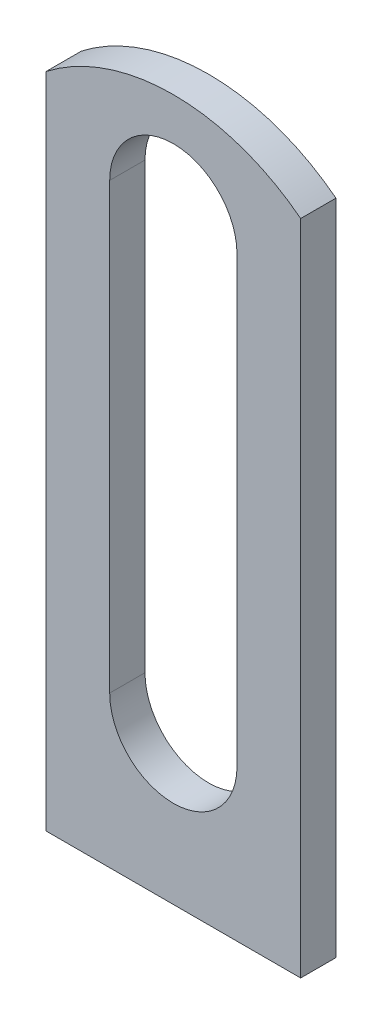
ISO-10303-21;
HEADER;
FILE_DESCRIPTION(('STEP AP214'),'2;1');
FILE_NAME('part.step','',(''),(''),'','','');
FILE_SCHEMA(('AUTOMOTIVE_DESIGN { 1 0 10303 214 1 1 1 1 }'));
ENDSEC;
DATA;
#1=APPLICATION_CONTEXT('core data for automotive mechanical design processes');
#2=APPLICATION_PROTOCOL_DEFINITION('international standard','automotive_design',2000,#1);
#3=PRODUCT_CONTEXT('',#1,'mechanical');
#4=PRODUCT('Part','Part','',(#3));
#5=PRODUCT_RELATED_PRODUCT_CATEGORY('part','',(#4));
#6=PRODUCT_DEFINITION_FORMATION('','',#4);
#7=PRODUCT_DEFINITION_CONTEXT('part definition',#1,'design');
#8=PRODUCT_DEFINITION('design','',#6,#7);
#9=PRODUCT_DEFINITION_SHAPE('','',#8);
#10=(LENGTH_UNIT() NAMED_UNIT(*) SI_UNIT(.MILLI.,.METRE.));
#11=(NAMED_UNIT(*) PLANE_ANGLE_UNIT() SI_UNIT($,.RADIAN.));
#12=(NAMED_UNIT(*) SI_UNIT($,.STERADIAN.) SOLID_ANGLE_UNIT());
#13=UNCERTAINTY_MEASURE_WITH_UNIT(LENGTH_MEASURE(1.E-05),#10,'distance_accuracy_value','');
#14=(GEOMETRIC_REPRESENTATION_CONTEXT(3) GLOBAL_UNCERTAINTY_ASSIGNED_CONTEXT((#13)) GLOBAL_UNIT_ASSIGNED_CONTEXT((#10,
#11,#12)) REPRESENTATION_CONTEXT('',''));
#15=CARTESIAN_POINT('',(0.,0.,0.));
#16=DIRECTION('',(0.,0.,1.));
#17=DIRECTION('',(1.,0.,0.));
#18=AXIS2_PLACEMENT_3D('',#15,#16,#17);
#19=CARTESIAN_POINT('',(0.,0.,0.));
#20=DIRECTION('',(0.,-1.,0.));
#21=DIRECTION('',(1.,0.,0.));
#22=AXIS2_PLACEMENT_3D('',#19,#20,#21);
#23=PLANE('',#22);
#24=DIRECTION('',(1.,0.,0.));
#25=VECTOR('',#24,1.);
#26=CARTESIAN_POINT('',(0.,0.,2.8));
#27=LINE('',#26,#25);
#28=CARTESIAN_POINT('',(0.,0.,2.8));
#29=VERTEX_POINT('',#28);
#30=CARTESIAN_POINT('',(20.2,0.,2.8));
#31=VERTEX_POINT('',#30);
#32=EDGE_CURVE('E131',#29,#31,#27,.T.);
#33=ORIENTED_EDGE('',*,*,#32,.F.);
#34=DIRECTION('',(0.,0.,1.));
#35=VECTOR('',#34,1.);
#36=CARTESIAN_POINT('',(0.,0.,0.));
#37=LINE('',#36,#35);
#38=CARTESIAN_POINT('',(0.,0.,0.));
#39=VERTEX_POINT('',#38);
#40=EDGE_CURVE('E11',#39,#29,#37,.T.);
#41=ORIENTED_EDGE('',*,*,#40,.F.);
#42=DIRECTION('',(1.,0.,0.));
#43=VECTOR('',#42,1.);
#44=CARTESIAN_POINT('',(0.,0.,0.));
#45=LINE('',#44,#43);
#46=CARTESIAN_POINT('',(20.2,0.,0.));
#47=VERTEX_POINT('',#46);
#48=EDGE_CURVE('E135',#39,#47,#45,.T.);
#49=ORIENTED_EDGE('',*,*,#48,.T.);
#50=DIRECTION('',(0.,0.,1.));
#51=VECTOR('',#50,1.);
#52=CARTESIAN_POINT('',(20.2,0.,0.));
#53=LINE('',#52,#51);
#54=EDGE_CURVE('E36',#47,#31,#53,.T.);
#55=ORIENTED_EDGE('',*,*,#54,.T.);
#56=EDGE_LOOP('',(#33,#41,#49,#55));
#57=FACE_BOUND('',#56,.T.);
#58=ADVANCED_FACE('F33',(#57),#23,.T.);
#59=CARTESIAN_POINT('',(0.,52.1796300253284,0.));
#60=DIRECTION('',(-1.,0.,0.));
#61=DIRECTION('',(0.,0.,1.));
#62=AXIS2_PLACEMENT_3D('',#59,#60,#61);
#63=PLANE('',#62);
#64=DIRECTION('',(0.,-1.,0.));
#65=VECTOR('',#64,1.);
#66=CARTESIAN_POINT('',(0.,52.1796300253284,2.8));
#67=LINE('',#66,#65);
#68=CARTESIAN_POINT('',(0.,52.1796300253284,2.8));
#69=VERTEX_POINT('',#68);
#70=EDGE_CURVE('E139',#69,#29,#67,.T.);
#71=ORIENTED_EDGE('',*,*,#70,.F.);
#72=DIRECTION('',(0.,0.,1.));
#73=VECTOR('',#72,1.);
#74=CARTESIAN_POINT('',(0.,52.1796300253284,0.));
#75=LINE('',#74,#73);
#76=CARTESIAN_POINT('',(0.,52.1796300253284,0.));
#77=VERTEX_POINT('',#76);
#78=EDGE_CURVE('E41',#77,#69,#75,.T.);
#79=ORIENTED_EDGE('',*,*,#78,.F.);
#80=DIRECTION('',(0.,-1.,0.));
#81=VECTOR('',#80,1.);
#82=CARTESIAN_POINT('',(0.,52.1796300253284,0.));
#83=LINE('',#82,#81);
#84=EDGE_CURVE('E145',#77,#39,#83,.T.);
#85=ORIENTED_EDGE('',*,*,#84,.T.);
#86=ORIENTED_EDGE('',*,*,#40,.T.);
#87=EDGE_LOOP('',(#71,#79,#85,#86));
#88=FACE_BOUND('',#87,.T.);
#89=ADVANCED_FACE('F171',(#88),#63,.T.);
#90=CARTESIAN_POINT('',(10.1,39.1850926484793,0.));
#91=DIRECTION('',(0.,0.,1.));
#92=DIRECTION('',(1.,0.,0.));
#93=AXIS2_PLACEMENT_3D('',#90,#91,#92);
#94=CYLINDRICAL_SURFACE('',#93,16.4580679801224);
#95=CARTESIAN_POINT('',(10.1,39.1850926484793,2.8));
#96=DIRECTION('',(0.,0.,1.));
#97=DIRECTION('',(-1.,0.,0.));
#98=AXIS2_PLACEMENT_3D('',#95,#96,#97);
#99=CIRCLE('',#98,16.4580679801224);
#100=CARTESIAN_POINT('',(20.2,52.1796300253284,2.8));
#101=VERTEX_POINT('',#100);
#102=EDGE_CURVE('E153',#101,#69,#99,.T.);
#103=ORIENTED_EDGE('',*,*,#102,.F.);
#104=DIRECTION('',(0.,0.,1.));
#105=VECTOR('',#104,1.);
#106=CARTESIAN_POINT('',(20.2,52.1796300253284,0.));
#107=LINE('',#106,#105);
#108=CARTESIAN_POINT('',(20.2,52.1796300253284,0.));
#109=VERTEX_POINT('',#108);
#110=EDGE_CURVE('E158',#109,#101,#107,.T.);
#111=ORIENTED_EDGE('',*,*,#110,.F.);
#112=CARTESIAN_POINT('',(10.1,39.1850926484793,0.));
#113=DIRECTION('',(0.,0.,1.));
#114=DIRECTION('',(-1.,0.,0.));
#115=AXIS2_PLACEMENT_3D('',#112,#113,#114);
#116=CIRCLE('',#115,16.4580679801224);
#117=EDGE_CURVE('E142',#109,#77,#116,.T.);
#118=ORIENTED_EDGE('',*,*,#117,.T.);
#119=ORIENTED_EDGE('',*,*,#78,.T.);
#120=EDGE_LOOP('',(#103,#111,#118,#119));
#121=FACE_BOUND('',#120,.T.);
#122=ADVANCED_FACE('F175',(#121),#94,.T.);
#123=CARTESIAN_POINT('',(20.2,0.,0.));
#124=DIRECTION('',(1.,0.,0.));
#125=DIRECTION('',(0.,0.,-1.));
#126=AXIS2_PLACEMENT_3D('',#123,#124,#125);
#127=PLANE('',#126);
#128=DIRECTION('',(0.,1.,0.));
#129=VECTOR('',#128,1.);
#130=CARTESIAN_POINT('',(20.2,0.,2.8));
#131=LINE('',#130,#129);
#132=EDGE_CURVE('E150',#31,#101,#131,.T.);
#133=ORIENTED_EDGE('',*,*,#132,.F.);
#134=ORIENTED_EDGE('',*,*,#54,.F.);
#135=DIRECTION('',(0.,1.,0.));
#136=VECTOR('',#135,1.);
#137=CARTESIAN_POINT('',(20.2,0.,0.));
#138=LINE('',#137,#136);
#139=EDGE_CURVE('E138',#47,#109,#138,.T.);
#140=ORIENTED_EDGE('',*,*,#139,.T.);
#141=ORIENTED_EDGE('',*,*,#110,.T.);
#142=EDGE_LOOP('',(#133,#134,#140,#141));
#143=FACE_BOUND('',#142,.T.);
#144=ADVANCED_FACE('F166',(#143),#127,.T.);
#145=CARTESIAN_POINT('',(10.1,39.1850926484793,0.));
#146=DIRECTION('',(0.,0.,-1.));
#147=DIRECTION('',(-1.,0.,0.));
#148=AXIS2_PLACEMENT_3D('',#145,#146,#147);
#149=PLANE('',#148);
#150=CARTESIAN_POINT('',(10.1,47.2223420938085,0.));
#151=DIRECTION('',(0.,0.,1.));
#152=DIRECTION('',(-1.,0.,0.));
#153=AXIS2_PLACEMENT_3D('',#150,#151,#152);
#154=CIRCLE('',#153,5.04999999999999);
#155=CARTESIAN_POINT('',(15.15,47.2223420938085,0.));
#156=VERTEX_POINT('',#155);
#157=CARTESIAN_POINT('',(5.05000000000003,47.2223420938085,0.));
#158=VERTEX_POINT('',#157);
#159=EDGE_CURVE('E100',#156,#158,#154,.T.);
#160=ORIENTED_EDGE('',*,*,#159,.T.);
#161=DIRECTION('',(0.,-1.,0.));
#162=VECTOR('',#161,1.);
#163=CARTESIAN_POINT('',(5.05,12.,0.));
#164=LINE('',#163,#162);
#165=CARTESIAN_POINT('',(5.05,12.,0.));
#166=VERTEX_POINT('',#165);
#167=EDGE_CURVE('E109',#158,#166,#164,.T.);
#168=ORIENTED_EDGE('',*,*,#167,.T.);
#169=CARTESIAN_POINT('',(10.1,12.,0.));
#170=DIRECTION('',(0.,0.,1.));
#171=DIRECTION('',(-1.,0.,0.));
#172=AXIS2_PLACEMENT_3D('',#169,#170,#171);
#173=CIRCLE('',#172,5.05);
#174=CARTESIAN_POINT('',(15.15,12.,0.));
#175=VERTEX_POINT('',#174);
#176=EDGE_CURVE('E49',#166,#175,#173,.T.);
#177=ORIENTED_EDGE('',*,*,#176,.T.);
#178=DIRECTION('',(0.,1.,0.));
#179=VECTOR('',#178,1.);
#180=CARTESIAN_POINT('',(15.15,47.2223420938085,0.));
#181=LINE('',#180,#179);
#182=EDGE_CURVE('E106',#175,#156,#181,.T.);
#183=ORIENTED_EDGE('',*,*,#182,.T.);
#184=EDGE_LOOP('',(#160,#168,#177,#183));
#185=FACE_BOUND('',#184,.T.);
#186=ORIENTED_EDGE('',*,*,#48,.F.);
#187=ORIENTED_EDGE('',*,*,#84,.F.);
#188=ORIENTED_EDGE('',*,*,#117,.F.);
#189=ORIENTED_EDGE('',*,*,#139,.F.);
#190=EDGE_LOOP('',(#186,#187,#188,#189));
#191=FACE_BOUND('',#190,.T.);
#192=ADVANCED_FACE('F113',(#185,#191),#149,.T.);
#193=CARTESIAN_POINT('',(10.1,39.1850926484793,2.8));
#194=DIRECTION('',(0.,0.,-1.));
#195=DIRECTION('',(-1.,0.,0.));
#196=AXIS2_PLACEMENT_3D('',#193,#194,#195);
#197=PLANE('',#196);
#198=DIRECTION('',(0.,-1.,0.));
#199=VECTOR('',#198,1.);
#200=CARTESIAN_POINT('',(5.05,12.,2.8));
#201=LINE('',#200,#199);
#202=CARTESIAN_POINT('',(5.05000000000003,47.2223420938085,2.8));
#203=VERTEX_POINT('',#202);
#204=CARTESIAN_POINT('',(5.05,12.,2.8));
#205=VERTEX_POINT('',#204);
#206=EDGE_CURVE('E125',#203,#205,#201,.T.);
#207=ORIENTED_EDGE('',*,*,#206,.F.);
#208=CARTESIAN_POINT('',(10.1,47.2223420938085,2.8));
#209=DIRECTION('',(0.,0.,1.));
#210=DIRECTION('',(-1.,0.,0.));
#211=AXIS2_PLACEMENT_3D('',#208,#209,#210);
#212=CIRCLE('',#211,5.04999999999999);
#213=CARTESIAN_POINT('',(15.15,47.2223420938085,2.8));
#214=VERTEX_POINT('',#213);
#215=EDGE_CURVE('E57',#214,#203,#212,.T.);
#216=ORIENTED_EDGE('',*,*,#215,.F.);
#217=DIRECTION('',(0.,1.,0.));
#218=VECTOR('',#217,1.);
#219=CARTESIAN_POINT('',(15.15,47.2223420938085,2.8));
#220=LINE('',#219,#218);
#221=CARTESIAN_POINT('',(15.15,12.,2.8));
#222=VERTEX_POINT('',#221);
#223=EDGE_CURVE('E116',#222,#214,#220,.T.);
#224=ORIENTED_EDGE('',*,*,#223,.F.);
#225=CARTESIAN_POINT('',(10.1,12.,2.8));
#226=DIRECTION('',(0.,0.,1.));
#227=DIRECTION('',(-1.,0.,0.));
#228=AXIS2_PLACEMENT_3D('',#225,#226,#227);
#229=CIRCLE('',#228,5.05);
#230=EDGE_CURVE('E119',#205,#222,#229,.T.);
#231=ORIENTED_EDGE('',*,*,#230,.F.);
#232=EDGE_LOOP('',(#207,#216,#224,#231));
#233=FACE_BOUND('',#232,.T.);
#234=ORIENTED_EDGE('',*,*,#32,.T.);
#235=ORIENTED_EDGE('',*,*,#132,.T.);
#236=ORIENTED_EDGE('',*,*,#102,.T.);
#237=ORIENTED_EDGE('',*,*,#70,.T.);
#238=EDGE_LOOP('',(#234,#235,#236,#237));
#239=FACE_BOUND('',#238,.T.);
#240=ADVANCED_FACE('F168',(#233,#239),#197,.F.);
#241=CARTESIAN_POINT('',(10.1,47.2223420938085,0.));
#242=DIRECTION('',(0.,0.,1.));
#243=DIRECTION('',(1.,0.,0.));
#244=AXIS2_PLACEMENT_3D('',#241,#242,#243);
#245=CYLINDRICAL_SURFACE('',#244,5.04999999999999);
#246=ORIENTED_EDGE('',*,*,#215,.T.);
#247=DIRECTION('',(0.,0.,1.));
#248=VECTOR('',#247,1.);
#249=CARTESIAN_POINT('',(5.05000000000003,47.2223420938085,0.));
#250=LINE('',#249,#248);
#251=EDGE_CURVE('E96',#158,#203,#250,.T.);
#252=ORIENTED_EDGE('',*,*,#251,.F.);
#253=ORIENTED_EDGE('',*,*,#159,.F.);
#254=DIRECTION('',(0.,0.,1.));
#255=VECTOR('',#254,1.);
#256=CARTESIAN_POINT('',(15.15,47.2223420938085,0.));
#257=LINE('',#256,#255);
#258=EDGE_CURVE('E129',#156,#214,#257,.T.);
#259=ORIENTED_EDGE('',*,*,#258,.T.);
#260=EDGE_LOOP('',(#246,#252,#253,#259));
#261=FACE_BOUND('',#260,.T.);
#262=ADVANCED_FACE('F98',(#261),#245,.F.);
#263=CARTESIAN_POINT('',(15.15,47.2223420938085,0.));
#264=DIRECTION('',(1.,0.,0.));
#265=DIRECTION('',(0.,1.,0.));
#266=AXIS2_PLACEMENT_3D('',#263,#264,#265);
#267=PLANE('',#266);
#268=ORIENTED_EDGE('',*,*,#223,.T.);
#269=ORIENTED_EDGE('',*,*,#258,.F.);
#270=ORIENTED_EDGE('',*,*,#182,.F.);
#271=DIRECTION('',(0.,0.,1.));
#272=VECTOR('',#271,1.);
#273=CARTESIAN_POINT('',(15.15,12.,0.));
#274=LINE('',#273,#272);
#275=EDGE_CURVE('E132',#175,#222,#274,.T.);
#276=ORIENTED_EDGE('',*,*,#275,.T.);
#277=EDGE_LOOP('',(#268,#269,#270,#276));
#278=FACE_BOUND('',#277,.T.);
#279=ADVANCED_FACE('F226',(#278),#267,.F.);
#280=CARTESIAN_POINT('',(10.1,12.,0.));
#281=DIRECTION('',(0.,0.,1.));
#282=DIRECTION('',(1.,0.,0.));
#283=AXIS2_PLACEMENT_3D('',#280,#281,#282);
#284=CYLINDRICAL_SURFACE('',#283,5.05);
#285=ORIENTED_EDGE('',*,*,#230,.T.);
#286=ORIENTED_EDGE('',*,*,#275,.F.);
#287=ORIENTED_EDGE('',*,*,#176,.F.);
#288=DIRECTION('',(0.,0.,1.));
#289=VECTOR('',#288,1.);
#290=CARTESIAN_POINT('',(5.05,12.,0.));
#291=LINE('',#290,#289);
#292=EDGE_CURVE('E105',#166,#205,#291,.T.);
#293=ORIENTED_EDGE('',*,*,#292,.T.);
#294=EDGE_LOOP('',(#285,#286,#287,#293));
#295=FACE_BOUND('',#294,.T.);
#296=ADVANCED_FACE('F235',(#295),#284,.F.);
#297=CARTESIAN_POINT('',(5.05,12.,0.));
#298=DIRECTION('',(-1.,0.,0.));
#299=DIRECTION('',(0.,-1.,0.));
#300=AXIS2_PLACEMENT_3D('',#297,#298,#299);
#301=PLANE('',#300);
#302=ORIENTED_EDGE('',*,*,#206,.T.);
#303=ORIENTED_EDGE('',*,*,#292,.F.);
#304=ORIENTED_EDGE('',*,*,#167,.F.);
#305=ORIENTED_EDGE('',*,*,#251,.T.);
#306=EDGE_LOOP('',(#302,#303,#304,#305));
#307=FACE_BOUND('',#306,.T.);
#308=ADVANCED_FACE('F110',(#307),#301,.F.);
#309=CLOSED_SHELL('',(#58,#89,#122,#144,#192,#240,#262,#279,#296,#308));
#310=MANIFOLD_SOLID_BREP('B2',#309);
#311=ADVANCED_BREP_SHAPE_REPRESENTATION('',(#18,#310),#14);
#312=SHAPE_DEFINITION_REPRESENTATION(#9,#311);
ENDSEC;
END-ISO-10303-21;
